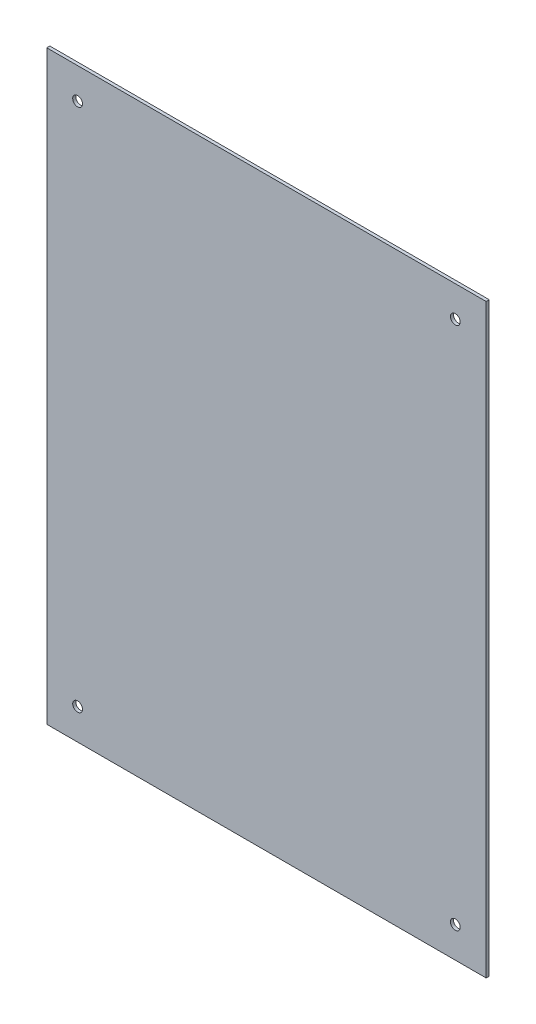
ISO-10303-21;
HEADER;
FILE_DESCRIPTION(('STEP AP214'),'2;1');
FILE_NAME('part.step','',(''),(''),'','','');
FILE_SCHEMA(('AUTOMOTIVE_DESIGN { 1 0 10303 214 1 1 1 1 }'));
ENDSEC;
DATA;
#1=APPLICATION_CONTEXT('core data for automotive mechanical design processes');
#2=APPLICATION_PROTOCOL_DEFINITION('international standard','automotive_design',2000,#1);
#3=PRODUCT_CONTEXT('',#1,'mechanical');
#4=PRODUCT('Part','Part','',(#3));
#5=PRODUCT_RELATED_PRODUCT_CATEGORY('part','',(#4));
#6=PRODUCT_DEFINITION_FORMATION('','',#4);
#7=PRODUCT_DEFINITION_CONTEXT('part definition',#1,'design');
#8=PRODUCT_DEFINITION('design','',#6,#7);
#9=PRODUCT_DEFINITION_SHAPE('','',#8);
#10=(LENGTH_UNIT() NAMED_UNIT(*) SI_UNIT(.MILLI.,.METRE.));
#11=(NAMED_UNIT(*) PLANE_ANGLE_UNIT() SI_UNIT($,.RADIAN.));
#12=(NAMED_UNIT(*) SI_UNIT($,.STERADIAN.) SOLID_ANGLE_UNIT());
#13=UNCERTAINTY_MEASURE_WITH_UNIT(LENGTH_MEASURE(1.E-05),#10,'distance_accuracy_value','');
#14=(GEOMETRIC_REPRESENTATION_CONTEXT(3) GLOBAL_UNCERTAINTY_ASSIGNED_CONTEXT((#13)) GLOBAL_UNIT_ASSIGNED_CONTEXT((#10,
#11,#12)) REPRESENTATION_CONTEXT('',''));
#15=CARTESIAN_POINT('',(0.,0.,0.));
#16=DIRECTION('',(0.,0.,1.));
#17=DIRECTION('',(1.,0.,0.));
#18=AXIS2_PLACEMENT_3D('',#15,#16,#17);
#19=CARTESIAN_POINT('',(205.,408.,2.));
#20=DIRECTION('',(-1.,0.,0.));
#21=DIRECTION('',(0.,-1.,0.));
#22=AXIS2_PLACEMENT_3D('',#19,#20,#21);
#23=PLANE('',#22);
#24=DIRECTION('',(0.,1.,0.));
#25=VECTOR('',#24,1.);
#26=CARTESIAN_POINT('',(205.,408.,0.));
#27=LINE('',#26,#25);
#28=CARTESIAN_POINT('',(205.,28.,0.));
#29=VERTEX_POINT('',#28);
#30=CARTESIAN_POINT('',(205.,408.,0.));
#31=VERTEX_POINT('',#30);
#32=EDGE_CURVE('E99',#29,#31,#27,.T.);
#33=ORIENTED_EDGE('',*,*,#32,.T.);
#34=DIRECTION('',(0.,0.,-1.));
#35=VECTOR('',#34,1.);
#36=CARTESIAN_POINT('',(205.,408.,2.));
#37=LINE('',#36,#35);
#38=CARTESIAN_POINT('',(205.,408.,2.));
#39=VERTEX_POINT('',#38);
#40=EDGE_CURVE('E11',#39,#31,#37,.T.);
#41=ORIENTED_EDGE('',*,*,#40,.F.);
#42=DIRECTION('',(0.,1.,0.));
#43=VECTOR('',#42,1.);
#44=CARTESIAN_POINT('',(205.,408.,2.));
#45=LINE('',#44,#43);
#46=CARTESIAN_POINT('',(205.,28.,2.));
#47=VERTEX_POINT('',#46);
#48=EDGE_CURVE('E86',#47,#39,#45,.T.);
#49=ORIENTED_EDGE('',*,*,#48,.F.);
#50=DIRECTION('',(0.,0.,-1.));
#51=VECTOR('',#50,1.);
#52=CARTESIAN_POINT('',(205.,28.,2.));
#53=LINE('',#52,#51);
#54=EDGE_CURVE('E95',#47,#29,#53,.T.);
#55=ORIENTED_EDGE('',*,*,#54,.T.);
#56=EDGE_LOOP('',(#33,#41,#49,#55));
#57=FACE_BOUND('',#56,.T.);
#58=ADVANCED_FACE('F33',(#57),#23,.F.);
#59=CARTESIAN_POINT('',(-80.,408.,2.));
#60=DIRECTION('',(0.,-1.,0.));
#61=DIRECTION('',(0.,0.,-1.));
#62=AXIS2_PLACEMENT_3D('',#59,#60,#61);
#63=PLANE('',#62);
#64=DIRECTION('',(-1.,0.,0.));
#65=VECTOR('',#64,1.);
#66=CARTESIAN_POINT('',(-80.,408.,0.));
#67=LINE('',#66,#65);
#68=CARTESIAN_POINT('',(-80.,408.,0.));
#69=VERTEX_POINT('',#68);
#70=EDGE_CURVE('E90',#31,#69,#67,.T.);
#71=ORIENTED_EDGE('',*,*,#70,.T.);
#72=DIRECTION('',(0.,0.,-1.));
#73=VECTOR('',#72,1.);
#74=CARTESIAN_POINT('',(-80.,408.,2.));
#75=LINE('',#74,#73);
#76=CARTESIAN_POINT('',(-80.,408.,2.));
#77=VERTEX_POINT('',#76);
#78=EDGE_CURVE('E42',#77,#69,#75,.T.);
#79=ORIENTED_EDGE('',*,*,#78,.F.);
#80=DIRECTION('',(-1.,0.,0.));
#81=VECTOR('',#80,1.);
#82=CARTESIAN_POINT('',(-80.,408.,2.));
#83=LINE('',#82,#81);
#84=EDGE_CURVE('E81',#39,#77,#83,.T.);
#85=ORIENTED_EDGE('',*,*,#84,.F.);
#86=ORIENTED_EDGE('',*,*,#40,.T.);
#87=EDGE_LOOP('',(#71,#79,#85,#86));
#88=FACE_BOUND('',#87,.T.);
#89=ADVANCED_FACE('F89',(#88),#63,.F.);
#90=CARTESIAN_POINT('',(-80.,408.,2.));
#91=DIRECTION('',(1.,0.,0.));
#92=DIRECTION('',(0.,1.,0.));
#93=AXIS2_PLACEMENT_3D('',#90,#91,#92);
#94=PLANE('',#93);
#95=DIRECTION('',(0.,-1.,0.));
#96=VECTOR('',#95,1.);
#97=CARTESIAN_POINT('',(-80.,408.,0.));
#98=LINE('',#97,#96);
#99=CARTESIAN_POINT('',(-79.9999999999999,28.,0.));
#100=VERTEX_POINT('',#99);
#101=EDGE_CURVE('E68',#69,#100,#98,.T.);
#102=ORIENTED_EDGE('',*,*,#101,.T.);
#103=DIRECTION('',(0.,0.,-1.));
#104=VECTOR('',#103,1.);
#105=CARTESIAN_POINT('',(-79.9999999999999,28.,2.));
#106=LINE('',#105,#104);
#107=CARTESIAN_POINT('',(-79.9999999999999,28.,2.));
#108=VERTEX_POINT('',#107);
#109=EDGE_CURVE('E91',#108,#100,#106,.T.);
#110=ORIENTED_EDGE('',*,*,#109,.F.);
#111=DIRECTION('',(0.,-1.,0.));
#112=VECTOR('',#111,1.);
#113=CARTESIAN_POINT('',(-80.,408.,2.));
#114=LINE('',#113,#112);
#115=EDGE_CURVE('E84',#77,#108,#114,.T.);
#116=ORIENTED_EDGE('',*,*,#115,.F.);
#117=ORIENTED_EDGE('',*,*,#78,.T.);
#118=EDGE_LOOP('',(#102,#110,#116,#117));
#119=FACE_BOUND('',#118,.T.);
#120=ADVANCED_FACE('F93',(#119),#94,.F.);
#121=CARTESIAN_POINT('',(-79.9999999999999,28.,2.));
#122=DIRECTION('',(0.,1.,0.));
#123=DIRECTION('',(0.,0.,1.));
#124=AXIS2_PLACEMENT_3D('',#121,#122,#123);
#125=PLANE('',#124);
#126=DIRECTION('',(1.,0.,0.));
#127=VECTOR('',#126,1.);
#128=CARTESIAN_POINT('',(-79.9999999999999,28.,0.));
#129=LINE('',#128,#127);
#130=EDGE_CURVE('E74',#100,#29,#129,.T.);
#131=ORIENTED_EDGE('',*,*,#130,.T.);
#132=ORIENTED_EDGE('',*,*,#54,.F.);
#133=DIRECTION('',(1.,0.,0.));
#134=VECTOR('',#133,1.);
#135=CARTESIAN_POINT('',(-79.9999999999999,28.,2.));
#136=LINE('',#135,#134);
#137=EDGE_CURVE('E51',#108,#47,#136,.T.);
#138=ORIENTED_EDGE('',*,*,#137,.F.);
#139=ORIENTED_EDGE('',*,*,#109,.T.);
#140=EDGE_LOOP('',(#131,#132,#138,#139));
#141=FACE_BOUND('',#140,.T.);
#142=ADVANCED_FACE('F141',(#141),#125,.F.);
#143=CARTESIAN_POINT('',(0.,0.,2.));
#144=DIRECTION('',(0.,0.,1.));
#145=DIRECTION('',(1.,0.,0.));
#146=AXIS2_PLACEMENT_3D('',#143,#144,#145);
#147=PLANE('',#146);
#148=CARTESIAN_POINT('',(185.,388.,2.));
#149=DIRECTION('',(0.,0.,1.));
#150=DIRECTION('',(-1.,0.,0.));
#151=AXIS2_PLACEMENT_3D('',#148,#149,#150);
#152=CIRCLE('',#151,3.17499999999999);
#153=CARTESIAN_POINT('',(181.825,388.,2.));
#154=VERTEX_POINT('',#153);
#155=EDGE_CURVE('E114',#154,#154,#152,.T.);
#156=ORIENTED_EDGE('',*,*,#155,.F.);
#157=EDGE_LOOP('',(#156));
#158=FACE_BOUND('',#157,.T.);
#159=CARTESIAN_POINT('',(185.,47.9999999999999,2.));
#160=DIRECTION('',(0.,0.,1.));
#161=DIRECTION('',(1.,0.,0.));
#162=AXIS2_PLACEMENT_3D('',#159,#160,#161);
#163=CIRCLE('',#162,3.17499999999999);
#164=CARTESIAN_POINT('',(188.175,47.9999999999999,2.));
#165=VERTEX_POINT('',#164);
#166=EDGE_CURVE('E129',#165,#165,#163,.T.);
#167=ORIENTED_EDGE('',*,*,#166,.F.);
#168=EDGE_LOOP('',(#167));
#169=FACE_BOUND('',#168,.T.);
#170=CARTESIAN_POINT('',(-60.,47.9999999999999,2.));
#171=DIRECTION('',(0.,0.,1.));
#172=DIRECTION('',(-1.,0.,0.));
#173=AXIS2_PLACEMENT_3D('',#170,#171,#172);
#174=CIRCLE('',#173,3.175);
#175=CARTESIAN_POINT('',(-63.175,47.9999999999999,2.));
#176=VERTEX_POINT('',#175);
#177=EDGE_CURVE('E126',#176,#176,#174,.T.);
#178=ORIENTED_EDGE('',*,*,#177,.F.);
#179=EDGE_LOOP('',(#178));
#180=FACE_BOUND('',#179,.T.);
#181=CARTESIAN_POINT('',(-60.,388.,2.));
#182=DIRECTION('',(0.,0.,1.));
#183=DIRECTION('',(1.,0.,0.));
#184=AXIS2_PLACEMENT_3D('',#181,#182,#183);
#185=CIRCLE('',#184,3.175);
#186=CARTESIAN_POINT('',(-56.825,388.,2.));
#187=VERTEX_POINT('',#186);
#188=EDGE_CURVE('E110',#187,#187,#185,.T.);
#189=ORIENTED_EDGE('',*,*,#188,.F.);
#190=EDGE_LOOP('',(#189));
#191=FACE_BOUND('',#190,.T.);
#192=ORIENTED_EDGE('',*,*,#48,.T.);
#193=ORIENTED_EDGE('',*,*,#84,.T.);
#194=ORIENTED_EDGE('',*,*,#115,.T.);
#195=ORIENTED_EDGE('',*,*,#137,.T.);
#196=EDGE_LOOP('',(#192,#193,#194,#195));
#197=FACE_BOUND('',#196,.T.);
#198=ADVANCED_FACE('F82',(#158,#169,#180,#191,#197),#147,.T.);
#199=CARTESIAN_POINT('',(0.,0.,0.));
#200=DIRECTION('',(0.,0.,1.));
#201=DIRECTION('',(1.,0.,0.));
#202=AXIS2_PLACEMENT_3D('',#199,#200,#201);
#203=PLANE('',#202);
#204=CARTESIAN_POINT('',(185.,388.,0.));
#205=DIRECTION('',(0.,0.,1.));
#206=DIRECTION('',(1.,0.,0.));
#207=AXIS2_PLACEMENT_3D('',#204,#205,#206);
#208=CIRCLE('',#207,3.17499999999999);
#209=CARTESIAN_POINT('',(188.175,388.,0.));
#210=VERTEX_POINT('',#209);
#211=EDGE_CURVE('E36',#210,#210,#208,.T.);
#212=ORIENTED_EDGE('',*,*,#211,.T.);
#213=EDGE_LOOP('',(#212));
#214=FACE_BOUND('',#213,.T.);
#215=CARTESIAN_POINT('',(185.,47.9999999999999,0.));
#216=DIRECTION('',(0.,0.,1.));
#217=DIRECTION('',(1.,0.,0.));
#218=AXIS2_PLACEMENT_3D('',#215,#216,#217);
#219=CIRCLE('',#218,3.17499999999999);
#220=CARTESIAN_POINT('',(188.175,47.9999999999999,0.));
#221=VERTEX_POINT('',#220);
#222=EDGE_CURVE('E113',#221,#221,#219,.T.);
#223=ORIENTED_EDGE('',*,*,#222,.T.);
#224=EDGE_LOOP('',(#223));
#225=FACE_BOUND('',#224,.T.);
#226=CARTESIAN_POINT('',(-60.,47.9999999999999,0.));
#227=DIRECTION('',(0.,0.,1.));
#228=DIRECTION('',(1.,0.,0.));
#229=AXIS2_PLACEMENT_3D('',#226,#227,#228);
#230=CIRCLE('',#229,3.175);
#231=CARTESIAN_POINT('',(-56.825,47.9999999999999,0.));
#232=VERTEX_POINT('',#231);
#233=EDGE_CURVE('E111',#232,#232,#230,.T.);
#234=ORIENTED_EDGE('',*,*,#233,.T.);
#235=EDGE_LOOP('',(#234));
#236=FACE_BOUND('',#235,.T.);
#237=CARTESIAN_POINT('',(-60.,388.,0.));
#238=DIRECTION('',(0.,0.,1.));
#239=DIRECTION('',(1.,0.,0.));
#240=AXIS2_PLACEMENT_3D('',#237,#238,#239);
#241=CIRCLE('',#240,3.175);
#242=CARTESIAN_POINT('',(-56.825,388.,0.));
#243=VERTEX_POINT('',#242);
#244=EDGE_CURVE('E102',#243,#243,#241,.T.);
#245=ORIENTED_EDGE('',*,*,#244,.T.);
#246=EDGE_LOOP('',(#245));
#247=FACE_BOUND('',#246,.T.);
#248=ORIENTED_EDGE('',*,*,#32,.F.);
#249=ORIENTED_EDGE('',*,*,#130,.F.);
#250=ORIENTED_EDGE('',*,*,#101,.F.);
#251=ORIENTED_EDGE('',*,*,#70,.F.);
#252=EDGE_LOOP('',(#248,#249,#250,#251));
#253=FACE_BOUND('',#252,.T.);
#254=ADVANCED_FACE('F140',(#214,#225,#236,#247,#253),#203,.F.);
#255=CARTESIAN_POINT('',(-60.,388.,-8.));
#256=DIRECTION('',(0.,0.,1.));
#257=DIRECTION('',(1.,0.,0.));
#258=AXIS2_PLACEMENT_3D('',#255,#256,#257);
#259=CYLINDRICAL_SURFACE('',#258,3.175);
#260=ORIENTED_EDGE('',*,*,#188,.T.);
#261=EDGE_LOOP('',(#260));
#262=FACE_BOUND('',#261,.T.);
#263=ORIENTED_EDGE('',*,*,#244,.F.);
#264=EDGE_LOOP('',(#263));
#265=FACE_BOUND('',#264,.T.);
#266=ADVANCED_FACE('F152',(#262,#265),#259,.F.);
#267=CARTESIAN_POINT('',(-60.,47.9999999999999,-8.));
#268=DIRECTION('',(0.,0.,1.));
#269=DIRECTION('',(1.,0.,0.));
#270=AXIS2_PLACEMENT_3D('',#267,#268,#269);
#271=CYLINDRICAL_SURFACE('',#270,3.175);
#272=ORIENTED_EDGE('',*,*,#177,.T.);
#273=EDGE_LOOP('',(#272));
#274=FACE_BOUND('',#273,.T.);
#275=ORIENTED_EDGE('',*,*,#233,.F.);
#276=EDGE_LOOP('',(#275));
#277=FACE_BOUND('',#276,.T.);
#278=ADVANCED_FACE('F148',(#274,#277),#271,.F.);
#279=CARTESIAN_POINT('',(185.,47.9999999999999,-8.));
#280=DIRECTION('',(0.,0.,1.));
#281=DIRECTION('',(1.,0.,0.));
#282=AXIS2_PLACEMENT_3D('',#279,#280,#281);
#283=CYLINDRICAL_SURFACE('',#282,3.17499999999999);
#284=ORIENTED_EDGE('',*,*,#166,.T.);
#285=EDGE_LOOP('',(#284));
#286=FACE_BOUND('',#285,.T.);
#287=ORIENTED_EDGE('',*,*,#222,.F.);
#288=EDGE_LOOP('',(#287));
#289=FACE_BOUND('',#288,.T.);
#290=ADVANCED_FACE('F151',(#286,#289),#283,.F.);
#291=CARTESIAN_POINT('',(185.,388.,-8.));
#292=DIRECTION('',(0.,0.,1.));
#293=DIRECTION('',(1.,0.,0.));
#294=AXIS2_PLACEMENT_3D('',#291,#292,#293);
#295=CYLINDRICAL_SURFACE('',#294,3.17499999999999);
#296=ORIENTED_EDGE('',*,*,#155,.T.);
#297=EDGE_LOOP('',(#296));
#298=FACE_BOUND('',#297,.T.);
#299=ORIENTED_EDGE('',*,*,#211,.F.);
#300=EDGE_LOOP('',(#299));
#301=FACE_BOUND('',#300,.T.);
#302=ADVANCED_FACE('F135',(#298,#301),#295,.F.);
#303=CLOSED_SHELL('',(#58,#89,#120,#142,#198,#254,#266,#278,#290,#302));
#304=MANIFOLD_SOLID_BREP('B2',#303);
#305=ADVANCED_BREP_SHAPE_REPRESENTATION('',(#18,#304),#14);
#306=SHAPE_DEFINITION_REPRESENTATION(#9,#305);
ENDSEC;
END-ISO-10303-21;
